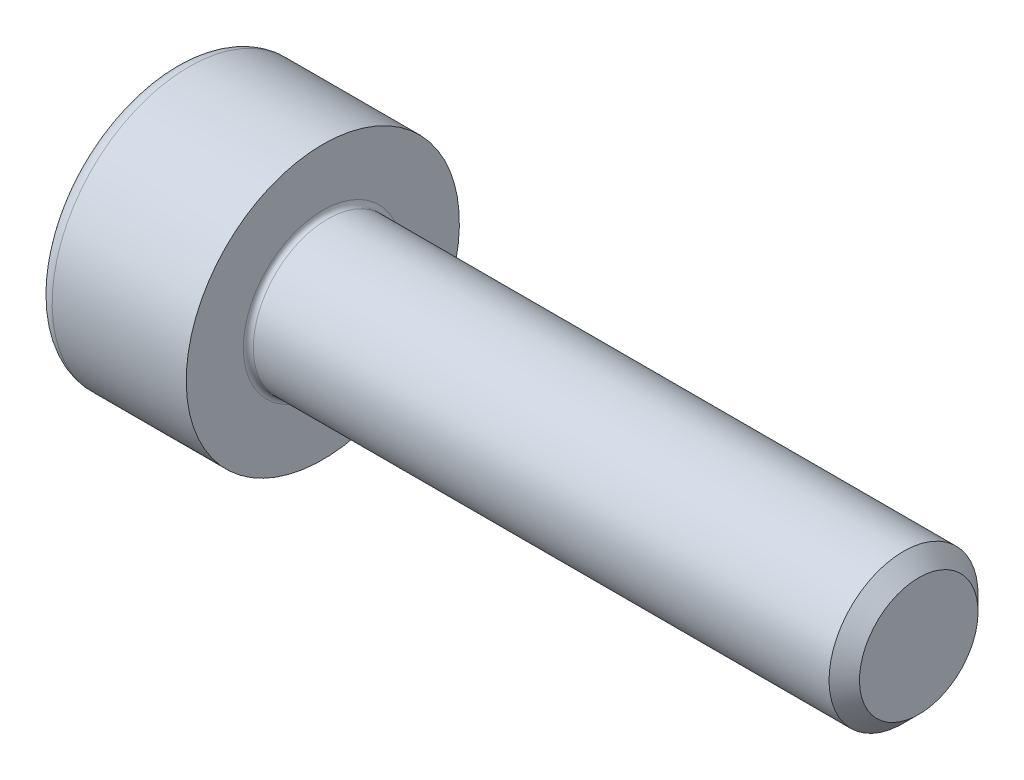
ISO-10303-21;
HEADER;
FILE_DESCRIPTION(('STEP AP214'),'2;1');
FILE_NAME('part.step','',(''),(''),'','','');
FILE_SCHEMA(('AUTOMOTIVE_DESIGN { 1 0 10303 214 1 1 1 1 }'));
ENDSEC;
DATA;
#1=APPLICATION_CONTEXT('core data for automotive mechanical design processes');
#2=APPLICATION_PROTOCOL_DEFINITION('international standard','automotive_design',2000,#1);
#3=PRODUCT_CONTEXT('',#1,'mechanical');
#4=PRODUCT('Part','Part','',(#3));
#5=PRODUCT_RELATED_PRODUCT_CATEGORY('part','',(#4));
#6=PRODUCT_DEFINITION_FORMATION('','',#4);
#7=PRODUCT_DEFINITION_CONTEXT('part definition',#1,'design');
#8=PRODUCT_DEFINITION('design','',#6,#7);
#9=PRODUCT_DEFINITION_SHAPE('','',#8);
#10=(LENGTH_UNIT() NAMED_UNIT(*) SI_UNIT(.MILLI.,.METRE.));
#11=(NAMED_UNIT(*) PLANE_ANGLE_UNIT() SI_UNIT($,.RADIAN.));
#12=(NAMED_UNIT(*) SI_UNIT($,.STERADIAN.) SOLID_ANGLE_UNIT());
#13=UNCERTAINTY_MEASURE_WITH_UNIT(LENGTH_MEASURE(1.E-05),#10,'distance_accuracy_value','');
#14=(GEOMETRIC_REPRESENTATION_CONTEXT(3) GLOBAL_UNCERTAINTY_ASSIGNED_CONTEXT((#13)) GLOBAL_UNIT_ASSIGNED_CONTEXT((#10,
#11,#12)) REPRESENTATION_CONTEXT('',''));
#15=CARTESIAN_POINT('',(0.,0.,0.));
#16=DIRECTION('',(0.,0.,1.));
#17=DIRECTION('',(1.,0.,0.));
#18=AXIS2_PLACEMENT_3D('',#15,#16,#17);
#19=CARTESIAN_POINT('',(0.100000000000002,0.,0.));
#20=DIRECTION('',(-1.,0.,0.));
#21=DIRECTION('',(0.,0.707106781186548,0.707106781186548));
#22=AXIS2_PLACEMENT_3D('',#19,#20,#21);
#23=TOROIDAL_SURFACE('',#22,1.6,0.1);
#24=CARTESIAN_POINT('',(0.,0.,0.));
#25=DIRECTION('',(1.,0.,0.));
#26=DIRECTION('',(0.,-1.,0.));
#27=AXIS2_PLACEMENT_3D('',#24,#25,#26);
#28=CIRCLE('',#27,1.6);
#29=CARTESIAN_POINT('',(0.,1.6,0.));
#30=VERTEX_POINT('',#29);
#31=EDGE_CURVE('E11',#30,#30,#28,.T.);
#32=ORIENTED_EDGE('',*,*,#31,.T.);
#33=EDGE_LOOP('',(#32));
#34=FACE_BOUND('',#33,.T.);
#35=CARTESIAN_POINT('',(0.100000000000002,0.,0.));
#36=DIRECTION('',(-1.,0.,0.));
#37=DIRECTION('',(0.,-1.,0.));
#38=AXIS2_PLACEMENT_3D('',#35,#36,#37);
#39=CIRCLE('',#38,1.5);
#40=CARTESIAN_POINT('',(0.100000000000002,1.5,0.));
#41=VERTEX_POINT('',#40);
#42=EDGE_CURVE('E29',#41,#41,#39,.T.);
#43=ORIENTED_EDGE('',*,*,#42,.T.);
#44=EDGE_LOOP('',(#43));
#45=FACE_BOUND('',#44,.T.);
#46=ADVANCED_FACE('F17',(#34,#45),#23,.F.);
#47=CARTESIAN_POINT('',(6.6533625,0.,0.));
#48=DIRECTION('',(1.,0.,0.));
#49=DIRECTION('',(0.,1.,0.));
#50=AXIS2_PLACEMENT_3D('',#47,#48,#49);
#51=CYLINDRICAL_SURFACE('',#50,1.5);
#52=CARTESIAN_POINT('',(11.693275,0.,0.));
#53=DIRECTION('',(1.,0.,0.));
#54=DIRECTION('',(0.,-1.,0.));
#55=AXIS2_PLACEMENT_3D('',#52,#53,#54);
#56=CIRCLE('',#55,1.5);
#57=CARTESIAN_POINT('',(11.693275,1.5,0.));
#58=VERTEX_POINT('',#57);
#59=EDGE_CURVE('E241',#58,#58,#56,.T.);
#60=ORIENTED_EDGE('',*,*,#59,.F.);
#61=EDGE_LOOP('',(#60));
#62=FACE_BOUND('',#61,.T.);
#63=ORIENTED_EDGE('',*,*,#42,.F.);
#64=EDGE_LOOP('',(#63));
#65=FACE_BOUND('',#64,.T.);
#66=ADVANCED_FACE('F104',(#62,#65),#51,.T.);
#67=CARTESIAN_POINT('',(0.,2.125,0.));
#68=DIRECTION('',(1.,0.,0.));
#69=DIRECTION('',(0.,0.707106781186548,0.707106781186548));
#70=AXIS2_PLACEMENT_3D('',#67,#68,#69);
#71=PLANE('',#70);
#72=CARTESIAN_POINT('',(0.,0.,0.));
#73=DIRECTION('',(1.,0.,0.));
#74=DIRECTION('',(0.,1.,0.));
#75=AXIS2_PLACEMENT_3D('',#72,#73,#74);
#76=CIRCLE('',#75,2.75);
#77=CARTESIAN_POINT('',(0.,2.75,0.));
#78=VERTEX_POINT('',#77);
#79=EDGE_CURVE('E242',#78,#78,#76,.T.);
#80=ORIENTED_EDGE('',*,*,#79,.T.);
#81=EDGE_LOOP('',(#80));
#82=FACE_BOUND('',#81,.T.);
#83=ORIENTED_EDGE('',*,*,#31,.F.);
#84=EDGE_LOOP('',(#83));
#85=FACE_BOUND('',#84,.T.);
#86=ADVANCED_FACE('F110',(#82,#85),#71,.T.);
#87=CARTESIAN_POINT('',(11.8466375,0.,0.));
#88=DIRECTION('',(-1.,0.,0.));
#89=DIRECTION('',(0.,-1.,0.));
#90=AXIS2_PLACEMENT_3D('',#87,#88,#89);
#91=CONICAL_SURFACE('',#90,1.3466375,0.785398163397445);
#92=ORIENTED_EDGE('',*,*,#59,.T.);
#93=EDGE_LOOP('',(#92));
#94=FACE_BOUND('',#93,.T.);
#95=CARTESIAN_POINT('',(12.,0.,0.));
#96=DIRECTION('',(-1.,0.,0.));
#97=DIRECTION('',(0.,-1.,0.));
#98=AXIS2_PLACEMENT_3D('',#95,#96,#97);
#99=CIRCLE('',#98,1.193275);
#100=CARTESIAN_POINT('',(12.,1.193275,0.));
#101=VERTEX_POINT('',#100);
#102=EDGE_CURVE('E238',#101,#101,#99,.T.);
#103=ORIENTED_EDGE('',*,*,#102,.T.);
#104=EDGE_LOOP('',(#103));
#105=FACE_BOUND('',#104,.T.);
#106=ADVANCED_FACE('F117',(#94,#105),#91,.T.);
#107=CARTESIAN_POINT('',(12.,0.75,0.));
#108=DIRECTION('',(1.,0.,0.));
#109=DIRECTION('',(0.,0.707106781186548,0.707106781186548));
#110=AXIS2_PLACEMENT_3D('',#107,#108,#109);
#111=PLANE('',#110);
#112=ORIENTED_EDGE('',*,*,#102,.F.);
#113=EDGE_LOOP('',(#112));
#114=FACE_BOUND('',#113,.T.);
#115=ADVANCED_FACE('F121',(#114),#111,.T.);
#116=CARTESIAN_POINT('',(-2.7,0.,0.));
#117=DIRECTION('',(1.,0.,0.));
#118=DIRECTION('',(0.,0.707106781186548,0.707106781186548));
#119=AXIS2_PLACEMENT_3D('',#116,#117,#118);
#120=TOROIDAL_SURFACE('',#119,2.45,0.3);
#121=CARTESIAN_POINT('',(-3.,0.,0.));
#122=DIRECTION('',(1.,0.,0.));
#123=DIRECTION('',(0.,-1.,0.));
#124=AXIS2_PLACEMENT_3D('',#121,#122,#123);
#125=CIRCLE('',#124,2.45);
#126=CARTESIAN_POINT('',(-3.,2.45,0.));
#127=VERTEX_POINT('',#126);
#128=EDGE_CURVE('E235',#127,#127,#125,.T.);
#129=ORIENTED_EDGE('',*,*,#128,.T.);
#130=EDGE_LOOP('',(#129));
#131=FACE_BOUND('',#130,.T.);
#132=CARTESIAN_POINT('',(-2.7,0.,0.));
#133=DIRECTION('',(-1.,0.,0.));
#134=DIRECTION('',(0.,-1.,0.));
#135=AXIS2_PLACEMENT_3D('',#132,#133,#134);
#136=CIRCLE('',#135,2.75);
#137=CARTESIAN_POINT('',(-2.7,2.75,0.));
#138=VERTEX_POINT('',#137);
#139=EDGE_CURVE('E232',#138,#138,#136,.T.);
#140=ORIENTED_EDGE('',*,*,#139,.T.);
#141=EDGE_LOOP('',(#140));
#142=FACE_BOUND('',#141,.T.);
#143=ADVANCED_FACE('F125',(#131,#142),#120,.T.);
#144=CARTESIAN_POINT('',(-3.,2.09668783648703,0.));
#145=DIRECTION('',(-1.,0.,0.));
#146=DIRECTION('',(0.,0.707106781186548,0.707106781186548));
#147=AXIS2_PLACEMENT_3D('',#144,#145,#146);
#148=PLANE('',#147);
#149=DIRECTION('',(0.,0.,1.));
#150=VECTOR('',#149,1.);
#151=CARTESIAN_POINT('',(-3.,1.25,0.360843918243514));
#152=LINE('',#151,#150);
#153=CARTESIAN_POINT('',(-3.,1.25,-0.721687836487033));
#154=VERTEX_POINT('',#153);
#155=CARTESIAN_POINT('',(-3.,1.25,0.721687836487031));
#156=VERTEX_POINT('',#155);
#157=EDGE_CURVE('E229',#154,#156,#152,.T.);
#158=ORIENTED_EDGE('',*,*,#157,.T.);
#159=DIRECTION('',(0.,-0.866025403784438,0.5));
#160=VECTOR('',#159,1.);
#161=CARTESIAN_POINT('',(-3.,0.3125,1.26295371385231));
#162=LINE('',#161,#160);
#163=CARTESIAN_POINT('',(-3.,0.,1.44337567297406));
#164=VERTEX_POINT('',#163);
#165=EDGE_CURVE('E226',#156,#164,#162,.T.);
#166=ORIENTED_EDGE('',*,*,#165,.T.);
#167=DIRECTION('',(0.,-0.866025403784439,-0.5));
#168=VECTOR('',#167,1.);
#169=CARTESIAN_POINT('',(-3.,-0.9375,0.902109795608791));
#170=LINE('',#169,#168);
#171=CARTESIAN_POINT('',(-3.,-1.25,0.721687836487033));
#172=VERTEX_POINT('',#171);
#173=EDGE_CURVE('E223',#164,#172,#170,.T.);
#174=ORIENTED_EDGE('',*,*,#173,.T.);
#175=DIRECTION('',(0.,0.,-1.));
#176=VECTOR('',#175,1.);
#177=CARTESIAN_POINT('',(-3.,-1.25,-0.360843918243516));
#178=LINE('',#177,#176);
#179=CARTESIAN_POINT('',(-3.,-1.25,-0.721687836487032));
#180=VERTEX_POINT('',#179);
#181=EDGE_CURVE('E220',#172,#180,#178,.T.);
#182=ORIENTED_EDGE('',*,*,#181,.T.);
#183=DIRECTION('',(0.,0.866025403784439,-0.5));
#184=VECTOR('',#183,1.);
#185=CARTESIAN_POINT('',(-3.,-0.3125,-1.26295371385231));
#186=LINE('',#185,#184);
#187=CARTESIAN_POINT('',(-3.,0.,-1.44337567297406));
#188=VERTEX_POINT('',#187);
#189=EDGE_CURVE('E217',#180,#188,#186,.T.);
#190=ORIENTED_EDGE('',*,*,#189,.T.);
#191=DIRECTION('',(0.,0.866025403784439,0.5));
#192=VECTOR('',#191,1.);
#193=CARTESIAN_POINT('',(-3.,0.9375,-0.902109795608791));
#194=LINE('',#193,#192);
#195=EDGE_CURVE('E209',#188,#154,#194,.T.);
#196=ORIENTED_EDGE('',*,*,#195,.T.);
#197=EDGE_LOOP('',(#158,#166,#174,#182,#190,#196));
#198=FACE_BOUND('',#197,.T.);
#199=ORIENTED_EDGE('',*,*,#128,.F.);
#200=EDGE_LOOP('',(#199));
#201=FACE_BOUND('',#200,.T.);
#202=ADVANCED_FACE('F129',(#198,#201),#148,.T.);
#203=CARTESIAN_POINT('',(-1.5,0.,0.));
#204=DIRECTION('',(1.,0.,0.));
#205=DIRECTION('',(0.,1.,0.));
#206=AXIS2_PLACEMENT_3D('',#203,#204,#205);
#207=CYLINDRICAL_SURFACE('',#206,2.75);
#208=ORIENTED_EDGE('',*,*,#79,.F.);
#209=EDGE_LOOP('',(#208));
#210=FACE_BOUND('',#209,.T.);
#211=ORIENTED_EDGE('',*,*,#139,.F.);
#212=EDGE_LOOP('',(#211));
#213=FACE_BOUND('',#212,.T.);
#214=ADVANCED_FACE('F133',(#210,#213),#207,.T.);
#215=CARTESIAN_POINT('',(-3.,0.,-1.44337567297406));
#216=DIRECTION('',(0.,-0.5,-0.866025403784439));
#217=DIRECTION('',(0.447213595499958,-0.774596669241483,0.447213595499958));
#218=AXIS2_PLACEMENT_3D('',#215,#216,#217);
#219=PLANE('',#218);
#220=CARTESIAN_POINT('',(-1.5,0.,-1.44337567297406));
#221=CARTESIAN_POINT('',(-1.29166666666666,-0.625000000000001,-1.08253175473055));
#222=CARTESIAN_POINT('',(-1.5,-1.25,-0.721687836487032));
#223=(BOUNDED_CURVE() B_SPLINE_CURVE(2,(#220,#221,#222),.UNSPECIFIED.,.F.,
.F.) B_SPLINE_CURVE_WITH_KNOTS((3,3),(0.,0.14605451725974),
.UNSPECIFIED.) CURVE() GEOMETRIC_REPRESENTATION_ITEM() RATIONAL_B_SPLINE_CURVE((1.,
1.15470053837925,1.)) REPRESENTATION_ITEM(''));
#224=CARTESIAN_POINT('',(-1.5,0.,-1.44337567297406));
#225=VERTEX_POINT('',#224);
#226=CARTESIAN_POINT('',(-1.5,-1.25,-0.721687836487032));
#227=VERTEX_POINT('',#226);
#228=EDGE_CURVE('E164',#225,#227,#223,.T.);
#229=ORIENTED_EDGE('',*,*,#228,.F.);
#230=DIRECTION('',(-1.,0.,0.));
#231=VECTOR('',#230,1.);
#232=CARTESIAN_POINT('',(-2.25,0.,-1.44337567297406));
#233=LINE('',#232,#231);
#234=EDGE_CURVE('E200',#225,#188,#233,.T.);
#235=ORIENTED_EDGE('',*,*,#234,.T.);
#236=ORIENTED_EDGE('',*,*,#189,.F.);
#237=DIRECTION('',(-1.,0.,0.));
#238=VECTOR('',#237,1.);
#239=CARTESIAN_POINT('',(-2.25,-1.25,-0.721687836487033));
#240=LINE('',#239,#238);
#241=EDGE_CURVE('E160',#227,#180,#240,.T.);
#242=ORIENTED_EDGE('',*,*,#241,.F.);
#243=EDGE_LOOP('',(#229,#235,#236,#242));
#244=FACE_BOUND('',#243,.T.);
#245=ADVANCED_FACE('F137',(#244),#219,.F.);
#246=CARTESIAN_POINT('',(-3.,1.25,-0.721687836487033));
#247=DIRECTION('',(0.,0.5,-0.866025403784439));
#248=DIRECTION('',(0.654653670707977,0.654653670707977,0.377964473009227));
#249=AXIS2_PLACEMENT_3D('',#246,#247,#248);
#250=PLANE('',#249);
#251=CARTESIAN_POINT('',(-1.5,1.25,-0.721687836487032));
#252=CARTESIAN_POINT('',(-1.29166666666666,0.625,-1.08253175473055));
#253=CARTESIAN_POINT('',(-1.5,0.,-1.44337567297406));
#254=(BOUNDED_CURVE() B_SPLINE_CURVE(2,(#251,#252,#253),.UNSPECIFIED.,.F.,
.F.) B_SPLINE_CURVE_WITH_KNOTS((3,3),(0.,0.14605451725974),
.UNSPECIFIED.) CURVE() GEOMETRIC_REPRESENTATION_ITEM() RATIONAL_B_SPLINE_CURVE((1.,
1.15470053837925,1.)) REPRESENTATION_ITEM(''));
#255=CARTESIAN_POINT('',(-1.5,1.25,-0.721687836487035));
#256=VERTEX_POINT('',#255);
#257=EDGE_CURVE('E166',#256,#225,#254,.T.);
#258=ORIENTED_EDGE('',*,*,#257,.F.);
#259=DIRECTION('',(-1.,0.,0.));
#260=VECTOR('',#259,1.);
#261=CARTESIAN_POINT('',(-2.25,1.25,-0.721687836487034));
#262=LINE('',#261,#260);
#263=EDGE_CURVE('E191',#256,#154,#262,.T.);
#264=ORIENTED_EDGE('',*,*,#263,.T.);
#265=ORIENTED_EDGE('',*,*,#195,.F.);
#266=ORIENTED_EDGE('',*,*,#234,.F.);
#267=EDGE_LOOP('',(#258,#264,#265,#266));
#268=FACE_BOUND('',#267,.T.);
#269=ADVANCED_FACE('F141',(#268),#250,.F.);
#270=CARTESIAN_POINT('',(-3.,1.25,0.721687836487031));
#271=DIRECTION('',(0.,1.,0.));
#272=DIRECTION('',(0.707106781186548,0.,0.707106781186548));
#273=AXIS2_PLACEMENT_3D('',#270,#271,#272);
#274=PLANE('',#273);
#275=CARTESIAN_POINT('',(-1.5,1.25,0.721687836487032));
#276=CARTESIAN_POINT('',(-1.29166666666666,1.25,0.));
#277=CARTESIAN_POINT('',(-1.5,1.25,-0.721687836487035));
#278=(BOUNDED_CURVE() B_SPLINE_CURVE(2,(#275,#276,#277),.UNSPECIFIED.,.F.,
.F.) B_SPLINE_CURVE_WITH_KNOTS((3,3),(0.,0.14605451725974),
.UNSPECIFIED.) CURVE() GEOMETRIC_REPRESENTATION_ITEM() RATIONAL_B_SPLINE_CURVE((1.,
1.15470053837925,1.)) REPRESENTATION_ITEM(''));
#279=CARTESIAN_POINT('',(-1.5,1.25,0.721687836487029));
#280=VERTEX_POINT('',#279);
#281=EDGE_CURVE('E181',#280,#256,#278,.T.);
#282=ORIENTED_EDGE('',*,*,#281,.F.);
#283=DIRECTION('',(-1.,0.,0.));
#284=VECTOR('',#283,1.);
#285=CARTESIAN_POINT('',(-2.25,1.25,0.72168783648703));
#286=LINE('',#285,#284);
#287=EDGE_CURVE('E176',#280,#156,#286,.T.);
#288=ORIENTED_EDGE('',*,*,#287,.T.);
#289=ORIENTED_EDGE('',*,*,#157,.F.);
#290=ORIENTED_EDGE('',*,*,#263,.F.);
#291=EDGE_LOOP('',(#282,#288,#289,#290));
#292=FACE_BOUND('',#291,.T.);
#293=ADVANCED_FACE('F145',(#292),#274,.F.);
#294=CARTESIAN_POINT('',(-3.,0.,1.44337567297406));
#295=DIRECTION('',(0.,0.5,0.866025403784438));
#296=DIRECTION('',(0.447213595499959,-0.774596669241483,0.447213595499959));
#297=AXIS2_PLACEMENT_3D('',#294,#295,#296);
#298=PLANE('',#297);
#299=CARTESIAN_POINT('',(-1.5,0.,1.44337567297406));
#300=CARTESIAN_POINT('',(-1.29166666666666,0.625000000000001,1.08253175473055));
#301=CARTESIAN_POINT('',(-1.5,1.25,0.72168783648703));
#302=(BOUNDED_CURVE() B_SPLINE_CURVE(2,(#299,#300,#301),.UNSPECIFIED.,.F.,
.F.) B_SPLINE_CURVE_WITH_KNOTS((3,3),(0.,0.14605451725974),
.UNSPECIFIED.) CURVE() GEOMETRIC_REPRESENTATION_ITEM() RATIONAL_B_SPLINE_CURVE((1.,
1.15470053837925,1.)) REPRESENTATION_ITEM(''));
#303=CARTESIAN_POINT('',(-1.5,0.,1.44337567297406));
#304=VERTEX_POINT('',#303);
#305=EDGE_CURVE('E179',#304,#280,#302,.T.);
#306=ORIENTED_EDGE('',*,*,#305,.F.);
#307=DIRECTION('',(1.,0.,0.));
#308=VECTOR('',#307,1.);
#309=CARTESIAN_POINT('',(-2.25,0.,1.44337567297406));
#310=LINE('',#309,#308);
#311=EDGE_CURVE('E171',#164,#304,#310,.T.);
#312=ORIENTED_EDGE('',*,*,#311,.F.);
#313=ORIENTED_EDGE('',*,*,#165,.F.);
#314=ORIENTED_EDGE('',*,*,#287,.F.);
#315=EDGE_LOOP('',(#306,#312,#313,#314));
#316=FACE_BOUND('',#315,.T.);
#317=ADVANCED_FACE('F149',(#316),#298,.F.);
#318=CARTESIAN_POINT('',(-3.,-1.25,-0.721687836487032));
#319=DIRECTION('',(0.,-1.,0.));
#320=DIRECTION('',(0.707106781186548,0.,0.707106781186548));
#321=AXIS2_PLACEMENT_3D('',#318,#319,#320);
#322=PLANE('',#321);
#323=CARTESIAN_POINT('',(-1.5,-1.25,-0.721687836487034));
#324=CARTESIAN_POINT('',(-1.29166666666666,-1.25,0.));
#325=CARTESIAN_POINT('',(-1.5,-1.25,0.721687836487034));
#326=(BOUNDED_CURVE() B_SPLINE_CURVE(2,(#323,#324,#325),.UNSPECIFIED.,.F.,
.F.) B_SPLINE_CURVE_WITH_KNOTS((3,3),(0.,0.14605451725974),
.UNSPECIFIED.) CURVE() GEOMETRIC_REPRESENTATION_ITEM() RATIONAL_B_SPLINE_CURVE((1.,
1.15470053837925,1.)) REPRESENTATION_ITEM(''));
#327=CARTESIAN_POINT('',(-1.5,-1.25,0.721687836487033));
#328=VERTEX_POINT('',#327);
#329=EDGE_CURVE('E90',#227,#328,#326,.T.);
#330=ORIENTED_EDGE('',*,*,#329,.F.);
#331=ORIENTED_EDGE('',*,*,#241,.T.);
#332=ORIENTED_EDGE('',*,*,#181,.F.);
#333=DIRECTION('',(-1.,0.,0.));
#334=VECTOR('',#333,1.);
#335=CARTESIAN_POINT('',(-2.25,-1.25,0.721687836487031));
#336=LINE('',#335,#334);
#337=EDGE_CURVE('E162',#328,#172,#336,.T.);
#338=ORIENTED_EDGE('',*,*,#337,.F.);
#339=EDGE_LOOP('',(#330,#331,#332,#338));
#340=FACE_BOUND('',#339,.T.);
#341=ADVANCED_FACE('F100',(#340),#322,.F.);
#342=CARTESIAN_POINT('',(-3.,-1.25,0.721687836487033));
#343=DIRECTION('',(0.,-0.5,0.866025403784439));
#344=DIRECTION('',(0.654653670707977,0.654653670707977,0.377964473009227));
#345=AXIS2_PLACEMENT_3D('',#342,#343,#344);
#346=PLANE('',#345);
#347=CARTESIAN_POINT('',(-1.5,-1.25,0.721687836487032));
#348=CARTESIAN_POINT('',(-1.29166666666666,-0.625,1.08253175473055));
#349=CARTESIAN_POINT('',(-1.5,0.,1.44337567297406));
#350=(BOUNDED_CURVE() B_SPLINE_CURVE(2,(#347,#348,#349),.UNSPECIFIED.,.F.,
.F.) B_SPLINE_CURVE_WITH_KNOTS((3,3),(0.,0.14605451725974),
.UNSPECIFIED.) CURVE() GEOMETRIC_REPRESENTATION_ITEM() RATIONAL_B_SPLINE_CURVE((1.,
1.15470053837925,1.)) REPRESENTATION_ITEM(''));
#351=EDGE_CURVE('E21',#328,#304,#350,.T.);
#352=ORIENTED_EDGE('',*,*,#351,.F.);
#353=ORIENTED_EDGE('',*,*,#337,.T.);
#354=ORIENTED_EDGE('',*,*,#173,.F.);
#355=ORIENTED_EDGE('',*,*,#311,.T.);
#356=EDGE_LOOP('',(#352,#353,#354,#355));
#357=FACE_BOUND('',#356,.T.);
#358=ADVANCED_FACE('F95',(#357),#346,.F.);
#359=CARTESIAN_POINT('',(-1.08333333333333,0.,0.));
#360=DIRECTION('',(-1.,0.,0.));
#361=DIRECTION('',(0.,1.,0.));
#362=AXIS2_PLACEMENT_3D('',#359,#360,#361);
#363=CONICAL_SURFACE('',#362,0.721687836487032,1.0471975511966);
#364=ORIENTED_EDGE('',*,*,#305,.T.);
#365=ORIENTED_EDGE('',*,*,#281,.T.);
#366=ORIENTED_EDGE('',*,*,#257,.T.);
#367=ORIENTED_EDGE('',*,*,#228,.T.);
#368=ORIENTED_EDGE('',*,*,#329,.T.);
#369=ORIENTED_EDGE('',*,*,#351,.T.);
#370=EDGE_LOOP('',(#364,#365,#366,#367,#368,#369));
#371=FACE_BOUND('',#370,.T.);
#372=CARTESIAN_POINT('',(-0.66666666666666,0.,0.));
#373=VERTEX_POINT('',#372);
#374=VERTEX_LOOP('',#373);
#375=FACE_BOUND('',#374,.T.);
#376=ADVANCED_FACE('F19',(#371,#375),#363,.F.);
#377=CLOSED_SHELL('',(#46,#66,#86,#106,#115,#143,#202,#214,#245,#269,#293,#317,#341,#358,#376));
#378=MANIFOLD_SOLID_BREP('B1',#377);
#379=ADVANCED_BREP_SHAPE_REPRESENTATION('',(#18,#378),#14);
#380=SHAPE_DEFINITION_REPRESENTATION(#9,#379);
ENDSEC;
END-ISO-10303-21;
